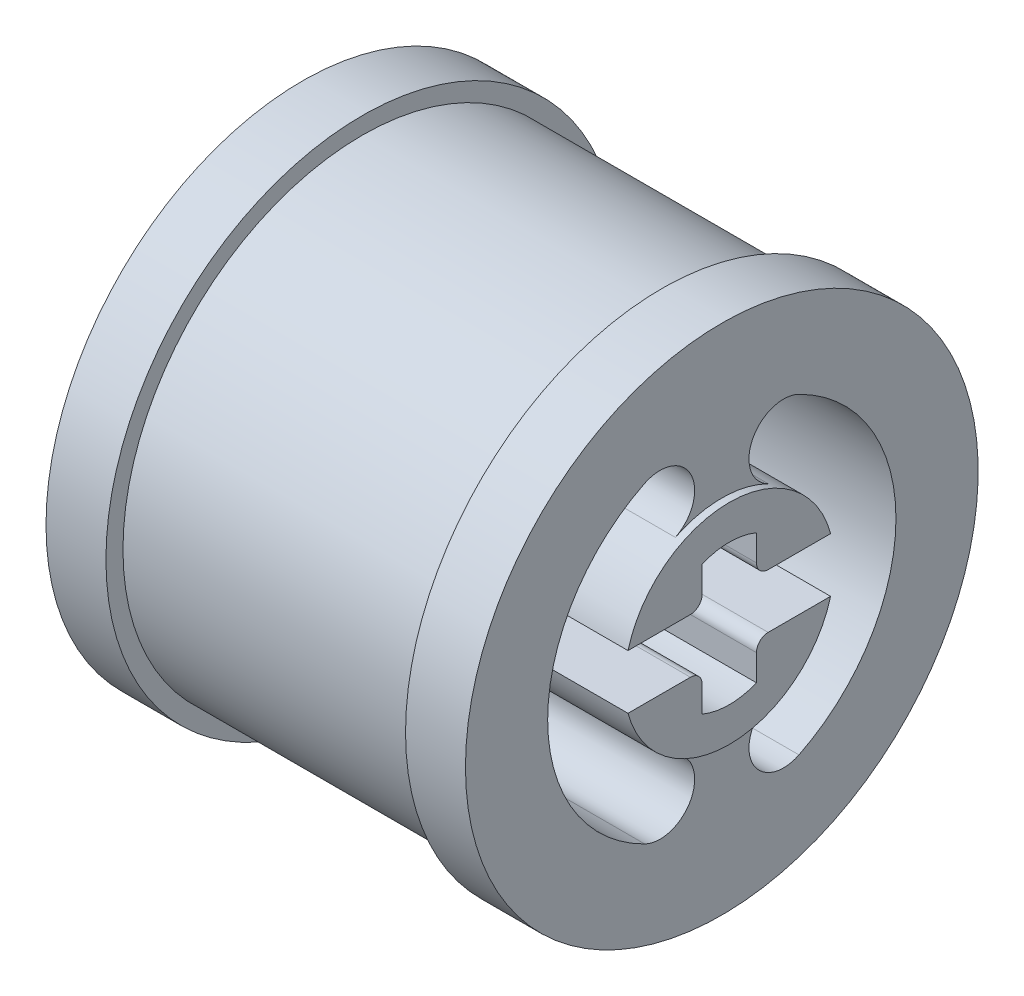
ISO-10303-21;
HEADER;
FILE_DESCRIPTION(('STEP AP214'),'2;1');
FILE_NAME('part.step','',(''),(''),'','','');
FILE_SCHEMA(('AUTOMOTIVE_DESIGN { 1 0 10303 214 1 1 1 1 }'));
ENDSEC;
DATA;
#1=APPLICATION_CONTEXT('core data for automotive mechanical design processes');
#2=APPLICATION_PROTOCOL_DEFINITION('international standard','automotive_design',2000,#1);
#3=PRODUCT_CONTEXT('',#1,'mechanical');
#4=PRODUCT('Part','Part','',(#3));
#5=PRODUCT_RELATED_PRODUCT_CATEGORY('part','',(#4));
#6=PRODUCT_DEFINITION_FORMATION('','',#4);
#7=PRODUCT_DEFINITION_CONTEXT('part definition',#1,'design');
#8=PRODUCT_DEFINITION('design','',#6,#7);
#9=PRODUCT_DEFINITION_SHAPE('','',#8);
#10=(LENGTH_UNIT() NAMED_UNIT(*) SI_UNIT(.MILLI.,.METRE.));
#11=(NAMED_UNIT(*) PLANE_ANGLE_UNIT() SI_UNIT($,.RADIAN.));
#12=(NAMED_UNIT(*) SI_UNIT($,.STERADIAN.) SOLID_ANGLE_UNIT());
#13=UNCERTAINTY_MEASURE_WITH_UNIT(LENGTH_MEASURE(1.E-05),#10,'distance_accuracy_value','');
#14=(GEOMETRIC_REPRESENTATION_CONTEXT(3) GLOBAL_UNCERTAINTY_ASSIGNED_CONTEXT((#13)) GLOBAL_UNIT_ASSIGNED_CONTEXT((#10,
#11,#12)) REPRESENTATION_CONTEXT('',''));
#15=CARTESIAN_POINT('',(0.,0.,0.));
#16=DIRECTION('',(0.,0.,1.));
#17=DIRECTION('',(1.,0.,0.));
#18=AXIS2_PLACEMENT_3D('',#15,#16,#17);
#19=CARTESIAN_POINT('',(7.366,0.,0.));
#20=DIRECTION('',(-1.,0.,0.));
#21=DIRECTION('',(0.,0.,1.));
#22=AXIS2_PLACEMENT_3D('',#19,#20,#21);
#23=CYLINDRICAL_SURFACE('',#22,3.556);
#24=CARTESIAN_POINT('',(-7.112,0.,0.));
#25=DIRECTION('',(-1.,0.,0.));
#26=DIRECTION('',(0.,0.,1.));
#27=AXIS2_PLACEMENT_3D('',#24,#25,#26);
#28=CIRCLE('',#27,3.556);
#29=CARTESIAN_POINT('',(-7.112,-3.18811339516092,1.57514093959732));
#30=VERTEX_POINT('',#29);
#31=CARTESIAN_POINT('',(-7.112,-3.18811339516092,-1.57514093959732));
#32=VERTEX_POINT('',#31);
#33=EDGE_CURVE('E283',#30,#32,#28,.F.);
#34=ORIENTED_EDGE('',*,*,#33,.F.);
#35=DIRECTION('',(1.,0.,0.));
#36=VECTOR('',#35,1.);
#37=CARTESIAN_POINT('',(0.,-3.18811339516092,1.57514093959732));
#38=LINE('',#37,#36);
#39=CARTESIAN_POINT('',(7.112,-3.18811339516092,1.57514093959732));
#40=VERTEX_POINT('',#39);
#41=EDGE_CURVE('E366',#30,#40,#38,.T.);
#42=ORIENTED_EDGE('',*,*,#41,.T.);
#43=CARTESIAN_POINT('',(7.112,0.,0.));
#44=DIRECTION('',(-1.,0.,0.));
#45=DIRECTION('',(0.,0.,1.));
#46=AXIS2_PLACEMENT_3D('',#43,#44,#45);
#47=CIRCLE('',#46,3.556);
#48=CARTESIAN_POINT('',(7.112,-3.18811339516092,-1.57514093959732));
#49=VERTEX_POINT('',#48);
#50=EDGE_CURVE('E383',#40,#49,#47,.F.);
#51=ORIENTED_EDGE('',*,*,#50,.T.);
#52=DIRECTION('',(1.,0.,0.));
#53=VECTOR('',#52,1.);
#54=CARTESIAN_POINT('',(0.,-3.18811339516092,-1.57514093959732));
#55=LINE('',#54,#53);
#56=EDGE_CURVE('E348',#32,#49,#55,.T.);
#57=ORIENTED_EDGE('',*,*,#56,.F.);
#58=EDGE_LOOP('',(#34,#42,#51,#57));
#59=FACE_BOUND('',#58,.T.);
#60=DIRECTION('',(1.,0.,0.));
#61=VECTOR('',#60,1.);
#62=CARTESIAN_POINT('',(0.,-0.92075,-3.43472785493989));
#63=LINE('',#62,#61);
#64=CARTESIAN_POINT('',(-7.366,-0.92075,-3.43472785493989));
#65=VERTEX_POINT('',#64);
#66=CARTESIAN_POINT('',(7.366,-0.92075,-3.43472785493989));
#67=VERTEX_POINT('',#66);
#68=EDGE_CURVE('E318',#65,#67,#63,.T.);
#69=ORIENTED_EDGE('',*,*,#68,.T.);
#70=CARTESIAN_POINT('',(7.366,0.,0.));
#71=DIRECTION('',(1.,0.,0.));
#72=DIRECTION('',(0.,0.,-1.));
#73=AXIS2_PLACEMENT_3D('',#70,#71,#72);
#74=CIRCLE('',#73,3.556);
#75=CARTESIAN_POINT('',(7.366,-0.920749999999999,3.43472785493989));
#76=VERTEX_POINT('',#75);
#77=EDGE_CURVE('E362',#76,#67,#74,.T.);
#78=ORIENTED_EDGE('',*,*,#77,.F.);
#79=DIRECTION('',(1.,0.,0.));
#80=VECTOR('',#79,1.);
#81=CARTESIAN_POINT('',(0.,-0.920749999999999,3.43472785493989));
#82=LINE('',#81,#80);
#83=CARTESIAN_POINT('',(-7.366,-0.920749999999999,3.43472785493989));
#84=VERTEX_POINT('',#83);
#85=EDGE_CURVE('E328',#84,#76,#82,.T.);
#86=ORIENTED_EDGE('',*,*,#85,.F.);
#87=CARTESIAN_POINT('',(-7.366,0.,0.));
#88=DIRECTION('',(1.,0.,0.));
#89=DIRECTION('',(0.,0.,-1.));
#90=AXIS2_PLACEMENT_3D('',#87,#88,#89);
#91=CIRCLE('',#90,3.556);
#92=EDGE_CURVE('E269',#84,#65,#91,.T.);
#93=ORIENTED_EDGE('',*,*,#92,.T.);
#94=EDGE_LOOP('',(#69,#78,#86,#93));
#95=FACE_BOUND('',#94,.T.);
#96=ADVANCED_FACE('F40',(#59,#95),#23,.T.);
#97=CARTESIAN_POINT('',(-7.366,0.92075,-3.43472785493989));
#98=VERTEX_POINT('',#97);
#99=CARTESIAN_POINT('',(-7.366,0.92075,3.43472785493989));
#100=VERTEX_POINT('',#99);
#101=EDGE_CURVE('E270',#98,#100,#91,.T.);
#102=ORIENTED_EDGE('',*,*,#101,.T.);
#103=DIRECTION('',(1.,0.,0.));
#104=VECTOR('',#103,1.);
#105=CARTESIAN_POINT('',(0.,0.92075,3.43472785493989));
#106=LINE('',#105,#104);
#107=CARTESIAN_POINT('',(7.366,0.92075,3.43472785493989));
#108=VERTEX_POINT('',#107);
#109=EDGE_CURVE('E330',#100,#108,#106,.T.);
#110=ORIENTED_EDGE('',*,*,#109,.T.);
#111=CARTESIAN_POINT('',(7.366,0.92075,-3.43472785493989));
#112=VERTEX_POINT('',#111);
#113=EDGE_CURVE('E370',#112,#108,#74,.T.);
#114=ORIENTED_EDGE('',*,*,#113,.F.);
#115=DIRECTION('',(1.,0.,0.));
#116=VECTOR('',#115,1.);
#117=CARTESIAN_POINT('',(0.,0.92075,-3.43472785493989));
#118=LINE('',#117,#116);
#119=EDGE_CURVE('E212',#98,#112,#118,.T.);
#120=ORIENTED_EDGE('',*,*,#119,.F.);
#121=EDGE_LOOP('',(#102,#110,#114,#120));
#122=FACE_BOUND('',#121,.T.);
#123=DIRECTION('',(1.,0.,0.));
#124=VECTOR('',#123,1.);
#125=CARTESIAN_POINT('',(0.,3.18811339516092,1.57514093959732));
#126=LINE('',#125,#124);
#127=CARTESIAN_POINT('',(-7.112,3.18811339516092,1.57514093959732));
#128=VERTEX_POINT('',#127);
#129=CARTESIAN_POINT('',(7.112,3.18811339516092,1.57514093959732));
#130=VERTEX_POINT('',#129);
#131=EDGE_CURVE('E363',#128,#130,#126,.T.);
#132=ORIENTED_EDGE('',*,*,#131,.F.);
#133=CARTESIAN_POINT('',(-7.112,3.18811339516092,-1.57514093959732));
#134=VERTEX_POINT('',#133);
#135=EDGE_CURVE('E282',#134,#128,#28,.F.);
#136=ORIENTED_EDGE('',*,*,#135,.F.);
#137=DIRECTION('',(1.,0.,0.));
#138=VECTOR('',#137,1.);
#139=CARTESIAN_POINT('',(0.,3.18811339516092,-1.57514093959732));
#140=LINE('',#139,#138);
#141=CARTESIAN_POINT('',(7.112,3.18811339516092,-1.57514093959732));
#142=VERTEX_POINT('',#141);
#143=EDGE_CURVE('E342',#134,#142,#140,.T.);
#144=ORIENTED_EDGE('',*,*,#143,.T.);
#145=EDGE_CURVE('E382',#142,#130,#47,.F.);
#146=ORIENTED_EDGE('',*,*,#145,.T.);
#147=EDGE_LOOP('',(#132,#136,#144,#146));
#148=FACE_BOUND('',#147,.T.);
#149=ADVANCED_FACE('F450',(#122,#148),#23,.T.);
#150=CARTESIAN_POINT('',(7.366,0.,0.));
#151=DIRECTION('',(1.,0.,0.));
#152=DIRECTION('',(0.,0.,-1.));
#153=AXIS2_PLACEMENT_3D('',#150,#151,#152);
#154=PLANE('',#153);
#155=DIRECTION('',(0.,-1.,0.));
#156=VECTOR('',#155,1.);
#157=CARTESIAN_POINT('',(7.366,-0.92075,0.92075));
#158=LINE('',#157,#156);
#159=CARTESIAN_POINT('',(7.366,-1.317625,0.92075));
#160=VERTEX_POINT('',#159);
#161=CARTESIAN_POINT('',(7.366,-2.20291924443453,0.92075));
#162=VERTEX_POINT('',#161);
#163=EDGE_CURVE('E309',#160,#162,#158,.T.);
#164=ORIENTED_EDGE('',*,*,#163,.F.);
#165=CARTESIAN_POINT('',(7.366,-1.317625,1.317625));
#166=DIRECTION('',(1.,0.,0.));
#167=DIRECTION('',(0.,0.,-1.));
#168=AXIS2_PLACEMENT_3D('',#165,#166,#167);
#169=CIRCLE('',#168,0.396875);
#170=CARTESIAN_POINT('',(7.366,-0.92075,1.317625));
#171=VERTEX_POINT('',#170);
#172=EDGE_CURVE('E55',#160,#171,#169,.T.);
#173=ORIENTED_EDGE('',*,*,#172,.T.);
#174=DIRECTION('',(0.,0.,-1.));
#175=VECTOR('',#174,1.);
#176=CARTESIAN_POINT('',(7.366,-0.92075,3.43472785493989));
#177=LINE('',#176,#175);
#178=EDGE_CURVE('E307',#76,#171,#177,.T.);
#179=ORIENTED_EDGE('',*,*,#178,.F.);
#180=ORIENTED_EDGE('',*,*,#77,.T.);
#181=DIRECTION('',(0.,0.,1.));
#182=VECTOR('',#181,1.);
#183=CARTESIAN_POINT('',(7.366,-0.92075,-3.43472785493989));
#184=LINE('',#183,#182);
#185=CARTESIAN_POINT('',(7.366,-0.92075,-1.317625));
#186=VERTEX_POINT('',#185);
#187=EDGE_CURVE('E316',#67,#186,#184,.T.);
#188=ORIENTED_EDGE('',*,*,#187,.T.);
#189=CARTESIAN_POINT('',(7.366,-1.317625,-1.317625));
#190=DIRECTION('',(1.,0.,0.));
#191=DIRECTION('',(0.,0.,-1.));
#192=AXIS2_PLACEMENT_3D('',#189,#190,#191);
#193=CIRCLE('',#192,0.396875);
#194=CARTESIAN_POINT('',(7.366,-1.317625,-0.92075));
#195=VERTEX_POINT('',#194);
#196=EDGE_CURVE('E62',#186,#195,#193,.T.);
#197=ORIENTED_EDGE('',*,*,#196,.T.);
#198=DIRECTION('',(0.,-1.,0.));
#199=VECTOR('',#198,1.);
#200=CARTESIAN_POINT('',(7.366,-0.92075,-0.92075));
#201=LINE('',#200,#199);
#202=CARTESIAN_POINT('',(7.366,-2.20291924443453,-0.92075));
#203=VERTEX_POINT('',#202);
#204=EDGE_CURVE('E314',#195,#203,#201,.T.);
#205=ORIENTED_EDGE('',*,*,#204,.T.);
#206=CARTESIAN_POINT('',(7.366,0.,0.));
#207=DIRECTION('',(-1.,0.,0.));
#208=DIRECTION('',(0.,0.,1.));
#209=AXIS2_PLACEMENT_3D('',#206,#207,#208);
#210=CIRCLE('',#209,2.3876);
#211=EDGE_CURVE('E311',#203,#162,#210,.T.);
#212=ORIENTED_EDGE('',*,*,#211,.T.);
#213=EDGE_LOOP('',(#164,#173,#179,#180,#188,#197,#205,#212));
#214=FACE_BOUND('',#213,.T.);
#215=ADVANCED_FACE('F412',(#214),#154,.T.);
#216=DIRECTION('',(0.,1.,0.));
#217=VECTOR('',#216,1.);
#218=CARTESIAN_POINT('',(7.366,0.92075,-0.92075));
#219=LINE('',#218,#217);
#220=CARTESIAN_POINT('',(7.366,1.317625,-0.92075));
#221=VERTEX_POINT('',#220);
#222=CARTESIAN_POINT('',(7.366,2.20291924443453,-0.92075));
#223=VERTEX_POINT('',#222);
#224=EDGE_CURVE('E207',#221,#223,#219,.T.);
#225=ORIENTED_EDGE('',*,*,#224,.F.);
#226=CARTESIAN_POINT('',(7.366,1.317625,-1.317625));
#227=DIRECTION('',(1.,0.,0.));
#228=DIRECTION('',(0.,0.,-1.));
#229=AXIS2_PLACEMENT_3D('',#226,#227,#228);
#230=CIRCLE('',#229,0.396875);
#231=CARTESIAN_POINT('',(7.366,0.92075,-1.317625));
#232=VERTEX_POINT('',#231);
#233=EDGE_CURVE('E390',#221,#232,#230,.T.);
#234=ORIENTED_EDGE('',*,*,#233,.T.);
#235=DIRECTION('',(0.,0.,1.));
#236=VECTOR('',#235,1.);
#237=CARTESIAN_POINT('',(7.366,0.92075,-3.43472785493989));
#238=LINE('',#237,#236);
#239=EDGE_CURVE('E296',#112,#232,#238,.T.);
#240=ORIENTED_EDGE('',*,*,#239,.F.);
#241=ORIENTED_EDGE('',*,*,#113,.T.);
#242=DIRECTION('',(0.,0.,-1.));
#243=VECTOR('',#242,1.);
#244=CARTESIAN_POINT('',(7.366,0.92075,3.43472785493989));
#245=LINE('',#244,#243);
#246=CARTESIAN_POINT('',(7.366,0.92075,1.317625));
#247=VERTEX_POINT('',#246);
#248=EDGE_CURVE('E304',#108,#247,#245,.T.);
#249=ORIENTED_EDGE('',*,*,#248,.T.);
#250=CARTESIAN_POINT('',(7.366,1.317625,1.317625));
#251=DIRECTION('',(1.,0.,0.));
#252=DIRECTION('',(0.,0.,-1.));
#253=AXIS2_PLACEMENT_3D('',#250,#251,#252);
#254=CIRCLE('',#253,0.396875);
#255=CARTESIAN_POINT('',(7.366,1.317625,0.92075));
#256=VERTEX_POINT('',#255);
#257=EDGE_CURVE('E388',#247,#256,#254,.T.);
#258=ORIENTED_EDGE('',*,*,#257,.T.);
#259=DIRECTION('',(0.,1.,0.));
#260=VECTOR('',#259,1.);
#261=CARTESIAN_POINT('',(7.366,0.92075,0.92075));
#262=LINE('',#261,#260);
#263=CARTESIAN_POINT('',(7.366,2.20291924443453,0.92075));
#264=VERTEX_POINT('',#263);
#265=EDGE_CURVE('E302',#256,#264,#262,.T.);
#266=ORIENTED_EDGE('',*,*,#265,.T.);
#267=CARTESIAN_POINT('',(7.366,0.,0.));
#268=DIRECTION('',(1.,0.,0.));
#269=DIRECTION('',(0.,0.,-1.));
#270=AXIS2_PLACEMENT_3D('',#267,#268,#269);
#271=CIRCLE('',#270,2.3876);
#272=EDGE_CURVE('E300',#223,#264,#271,.T.);
#273=ORIENTED_EDGE('',*,*,#272,.F.);
#274=EDGE_LOOP('',(#225,#234,#240,#241,#249,#258,#266,#273));
#275=FACE_BOUND('',#274,.T.);
#276=ADVANCED_FACE('F476',(#275),#154,.T.);
#277=CARTESIAN_POINT('',(7.112,0.,0.));
#278=DIRECTION('',(-1.,0.,0.));
#279=DIRECTION('',(0.,0.,1.));
#280=AXIS2_PLACEMENT_3D('',#277,#278,#279);
#281=PLANE('',#280);
#282=CARTESIAN_POINT('',(7.112,0.,0.));
#283=DIRECTION('',(-1.,0.,0.));
#284=DIRECTION('',(0.,0.,1.));
#285=AXIS2_PLACEMENT_3D('',#282,#283,#284);
#286=CIRCLE('',#285,8.69315);
#287=CARTESIAN_POINT('',(7.112,0.,8.69315));
#288=VERTEX_POINT('',#287);
#289=EDGE_CURVE('E379',#288,#288,#286,.T.);
#290=ORIENTED_EDGE('',*,*,#289,.F.);
#291=EDGE_LOOP('',(#290));
#292=FACE_BOUND('',#291,.T.);
#293=ORIENTED_EDGE('',*,*,#145,.F.);
#294=CARTESIAN_POINT('',(7.112,4.24132942749087,-2.0955));
#295=DIRECTION('',(1.,0.,0.));
#296=DIRECTION('',(0.,0.,-1.));
#297=AXIS2_PLACEMENT_3D('',#294,#295,#296);
#298=CIRCLE('',#297,1.17475);
#299=CARTESIAN_POINT('',(7.112,5.29454545982081,-2.61585906040269));
#300=VERTEX_POINT('',#299);
#301=EDGE_CURVE('E321',#300,#142,#298,.T.);
#302=ORIENTED_EDGE('',*,*,#301,.F.);
#303=CARTESIAN_POINT('',(7.112,0.,0.));
#304=DIRECTION('',(1.,0.,0.));
#305=DIRECTION('',(0.,0.,-1.));
#306=AXIS2_PLACEMENT_3D('',#303,#304,#305);
#307=CIRCLE('',#306,5.9055);
#308=CARTESIAN_POINT('',(7.112,-5.29454545982081,-2.61585906040268));
#309=VERTEX_POINT('',#308);
#310=EDGE_CURVE('E339',#309,#300,#307,.T.);
#311=ORIENTED_EDGE('',*,*,#310,.F.);
#312=CARTESIAN_POINT('',(7.112,-4.24132942749087,-2.0955));
#313=DIRECTION('',(-1.,0.,0.));
#314=DIRECTION('',(0.,0.,1.));
#315=AXIS2_PLACEMENT_3D('',#312,#313,#314);
#316=CIRCLE('',#315,1.17475);
#317=EDGE_CURVE('E336',#309,#49,#316,.T.);
#318=ORIENTED_EDGE('',*,*,#317,.T.);
#319=ORIENTED_EDGE('',*,*,#50,.F.);
#320=CARTESIAN_POINT('',(7.112,-4.24132942749087,2.0955));
#321=DIRECTION('',(1.,0.,0.));
#322=DIRECTION('',(0.,0.,-1.));
#323=AXIS2_PLACEMENT_3D('',#320,#321,#322);
#324=CIRCLE('',#323,1.17475);
#325=CARTESIAN_POINT('',(7.112,-5.29454545982081,2.61585906040269));
#326=VERTEX_POINT('',#325);
#327=EDGE_CURVE('E354',#326,#40,#324,.T.);
#328=ORIENTED_EDGE('',*,*,#327,.F.);
#329=CARTESIAN_POINT('',(7.112,0.,0.));
#330=DIRECTION('',(1.,0.,0.));
#331=DIRECTION('',(0.,0.,-1.));
#332=AXIS2_PLACEMENT_3D('',#329,#330,#331);
#333=CIRCLE('',#332,5.9055);
#334=CARTESIAN_POINT('',(7.112,5.29454545982081,2.61585906040269));
#335=VERTEX_POINT('',#334);
#336=EDGE_CURVE('E345',#335,#326,#333,.T.);
#337=ORIENTED_EDGE('',*,*,#336,.F.);
#338=CARTESIAN_POINT('',(7.112,4.24132942749087,2.0955));
#339=DIRECTION('',(-1.,0.,0.));
#340=DIRECTION('',(0.,0.,1.));
#341=AXIS2_PLACEMENT_3D('',#338,#339,#340);
#342=CIRCLE('',#341,1.17475);
#343=EDGE_CURVE('E356',#335,#130,#342,.T.);
#344=ORIENTED_EDGE('',*,*,#343,.T.);
#345=EDGE_LOOP('',(#293,#302,#311,#318,#319,#328,#337,#344));
#346=FACE_BOUND('',#345,.T.);
#347=ADVANCED_FACE('F473',(#292,#346),#281,.F.);
#348=CARTESIAN_POINT('',(0.,0.,0.));
#349=DIRECTION('',(-1.,0.,0.));
#350=DIRECTION('',(0.,0.,1.));
#351=AXIS2_PLACEMENT_3D('',#348,#349,#350);
#352=CYLINDRICAL_SURFACE('',#351,8.69315);
#353=ORIENTED_EDGE('',*,*,#289,.T.);
#354=EDGE_LOOP('',(#353));
#355=FACE_BOUND('',#354,.T.);
#356=CARTESIAN_POINT('',(5.08,0.,0.));
#357=DIRECTION('',(-1.,0.,0.));
#358=DIRECTION('',(0.,0.,1.));
#359=AXIS2_PLACEMENT_3D('',#356,#357,#358);
#360=CIRCLE('',#359,8.69315);
#361=CARTESIAN_POINT('',(5.08,0.,8.69315));
#362=VERTEX_POINT('',#361);
#363=EDGE_CURVE('E376',#362,#362,#360,.T.);
#364=ORIENTED_EDGE('',*,*,#363,.F.);
#365=EDGE_LOOP('',(#364));
#366=FACE_BOUND('',#365,.T.);
#367=ADVANCED_FACE('F469',(#355,#366),#352,.T.);
#368=CARTESIAN_POINT('',(5.08,8.1153,0.));
#369=DIRECTION('',(-1.,0.,0.));
#370=DIRECTION('',(0.,0.,1.));
#371=AXIS2_PLACEMENT_3D('',#368,#369,#370);
#372=PLANE('',#371);
#373=ORIENTED_EDGE('',*,*,#363,.T.);
#374=EDGE_LOOP('',(#373));
#375=FACE_BOUND('',#374,.T.);
#376=CARTESIAN_POINT('',(5.08,0.,0.));
#377=DIRECTION('',(-1.,0.,0.));
#378=DIRECTION('',(0.,0.,1.));
#379=AXIS2_PLACEMENT_3D('',#376,#377,#378);
#380=CIRCLE('',#379,8.1153);
#381=CARTESIAN_POINT('',(5.08,0.,8.1153));
#382=VERTEX_POINT('',#381);
#383=EDGE_CURVE('E373',#382,#382,#380,.T.);
#384=ORIENTED_EDGE('',*,*,#383,.F.);
#385=EDGE_LOOP('',(#384));
#386=FACE_BOUND('',#385,.T.);
#387=ADVANCED_FACE('F465',(#375,#386),#372,.T.);
#388=CARTESIAN_POINT('',(0.,0.,0.));
#389=DIRECTION('',(-1.,0.,0.));
#390=DIRECTION('',(0.,0.,1.));
#391=AXIS2_PLACEMENT_3D('',#388,#389,#390);
#392=CYLINDRICAL_SURFACE('',#391,8.1153);
#393=ORIENTED_EDGE('',*,*,#383,.T.);
#394=EDGE_LOOP('',(#393));
#395=FACE_BOUND('',#394,.T.);
#396=CARTESIAN_POINT('',(-5.08,0.,0.));
#397=DIRECTION('',(-1.,0.,0.));
#398=DIRECTION('',(0.,0.,1.));
#399=AXIS2_PLACEMENT_3D('',#396,#397,#398);
#400=CIRCLE('',#399,8.1153);
#401=CARTESIAN_POINT('',(-5.08,0.,8.1153));
#402=VERTEX_POINT('',#401);
#403=EDGE_CURVE('E273',#402,#402,#400,.T.);
#404=ORIENTED_EDGE('',*,*,#403,.F.);
#405=EDGE_LOOP('',(#404));
#406=FACE_BOUND('',#405,.T.);
#407=ADVANCED_FACE('F461',(#395,#406),#392,.T.);
#408=CARTESIAN_POINT('',(0.,0.,0.));
#409=DIRECTION('',(1.,0.,0.));
#410=DIRECTION('',(0.,0.,-1.));
#411=AXIS2_PLACEMENT_3D('',#408,#409,#410);
#412=CYLINDRICAL_SURFACE('',#411,5.9055);
#413=ORIENTED_EDGE('',*,*,#336,.T.);
#414=DIRECTION('',(1.,0.,0.));
#415=VECTOR('',#414,1.);
#416=CARTESIAN_POINT('',(0.,-5.29454545982081,2.61585906040269));
#417=LINE('',#416,#415);
#418=CARTESIAN_POINT('',(-7.112,-5.29454545982081,2.61585906040269));
#419=VERTEX_POINT('',#418);
#420=EDGE_CURVE('E359',#419,#326,#417,.T.);
#421=ORIENTED_EDGE('',*,*,#420,.F.);
#422=CARTESIAN_POINT('',(-7.112,0.,0.));
#423=DIRECTION('',(1.,0.,0.));
#424=DIRECTION('',(0.,0.,-1.));
#425=AXIS2_PLACEMENT_3D('',#422,#423,#424);
#426=CIRCLE('',#425,5.9055);
#427=CARTESIAN_POINT('',(-7.112,5.29454545982081,2.61585906040269));
#428=VERTEX_POINT('',#427);
#429=EDGE_CURVE('E260',#428,#419,#426,.T.);
#430=ORIENTED_EDGE('',*,*,#429,.F.);
#431=DIRECTION('',(1.,0.,0.));
#432=VECTOR('',#431,1.);
#433=CARTESIAN_POINT('',(0.,5.29454545982081,2.61585906040269));
#434=LINE('',#433,#432);
#435=EDGE_CURVE('E360',#428,#335,#434,.T.);
#436=ORIENTED_EDGE('',*,*,#435,.T.);
#437=EDGE_LOOP('',(#413,#421,#430,#436));
#438=FACE_BOUND('',#437,.T.);
#439=ADVANCED_FACE('F464',(#438),#412,.F.);
#440=CARTESIAN_POINT('',(0.,4.24132942749087,2.0955));
#441=DIRECTION('',(1.,0.,0.));
#442=DIRECTION('',(0.,0.,-1.));
#443=AXIS2_PLACEMENT_3D('',#440,#441,#442);
#444=CYLINDRICAL_SURFACE('',#443,1.17475);
#445=ORIENTED_EDGE('',*,*,#343,.F.);
#446=ORIENTED_EDGE('',*,*,#435,.F.);
#447=CARTESIAN_POINT('',(-7.112,4.24132942749087,2.0955));
#448=DIRECTION('',(-1.,0.,0.));
#449=DIRECTION('',(0.,0.,1.));
#450=AXIS2_PLACEMENT_3D('',#447,#448,#449);
#451=CIRCLE('',#450,1.17475);
#452=EDGE_CURVE('E266',#428,#128,#451,.T.);
#453=ORIENTED_EDGE('',*,*,#452,.T.);
#454=ORIENTED_EDGE('',*,*,#131,.T.);
#455=EDGE_LOOP('',(#445,#446,#453,#454));
#456=FACE_BOUND('',#455,.T.);
#457=ADVANCED_FACE('F717',(#456),#444,.F.);
#458=CARTESIAN_POINT('',(0.,-4.24132942749087,2.0955));
#459=DIRECTION('',(1.,0.,0.));
#460=DIRECTION('',(0.,0.,-1.));
#461=AXIS2_PLACEMENT_3D('',#458,#459,#460);
#462=CYLINDRICAL_SURFACE('',#461,1.17475);
#463=ORIENTED_EDGE('',*,*,#327,.T.);
#464=ORIENTED_EDGE('',*,*,#41,.F.);
#465=CARTESIAN_POINT('',(-7.112,-4.24132942749087,2.0955));
#466=DIRECTION('',(1.,0.,0.));
#467=DIRECTION('',(0.,0.,-1.));
#468=AXIS2_PLACEMENT_3D('',#465,#466,#467);
#469=CIRCLE('',#468,1.17475);
#470=EDGE_CURVE('E263',#419,#30,#469,.T.);
#471=ORIENTED_EDGE('',*,*,#470,.F.);
#472=ORIENTED_EDGE('',*,*,#420,.T.);
#473=EDGE_LOOP('',(#463,#464,#471,#472));
#474=FACE_BOUND('',#473,.T.);
#475=ADVANCED_FACE('F706',(#474),#462,.F.);
#476=CARTESIAN_POINT('',(0.,4.24132942749087,-2.0955));
#477=DIRECTION('',(1.,0.,0.));
#478=DIRECTION('',(0.,0.,-1.));
#479=AXIS2_PLACEMENT_3D('',#476,#477,#478);
#480=CYLINDRICAL_SURFACE('',#479,1.17475);
#481=ORIENTED_EDGE('',*,*,#301,.T.);
#482=ORIENTED_EDGE('',*,*,#143,.F.);
#483=CARTESIAN_POINT('',(-7.112,4.24132942749087,-2.0955));
#484=DIRECTION('',(1.,0.,0.));
#485=DIRECTION('',(0.,0.,-1.));
#486=AXIS2_PLACEMENT_3D('',#483,#484,#485);
#487=CIRCLE('',#486,1.17475);
#488=CARTESIAN_POINT('',(-7.112,5.29454545982081,-2.61585906040269));
#489=VERTEX_POINT('',#488);
#490=EDGE_CURVE('E251',#489,#134,#487,.T.);
#491=ORIENTED_EDGE('',*,*,#490,.F.);
#492=DIRECTION('',(1.,0.,0.));
#493=VECTOR('',#492,1.);
#494=CARTESIAN_POINT('',(0.,5.29454545982081,-2.61585906040269));
#495=LINE('',#494,#493);
#496=EDGE_CURVE('E343',#489,#300,#495,.T.);
#497=ORIENTED_EDGE('',*,*,#496,.T.);
#498=EDGE_LOOP('',(#481,#482,#491,#497));
#499=FACE_BOUND('',#498,.T.);
#500=ADVANCED_FACE('F695',(#499),#480,.F.);
#501=CARTESIAN_POINT('',(0.,0.,0.));
#502=DIRECTION('',(1.,0.,0.));
#503=DIRECTION('',(0.,0.,-1.));
#504=AXIS2_PLACEMENT_3D('',#501,#502,#503);
#505=CYLINDRICAL_SURFACE('',#504,5.9055);
#506=ORIENTED_EDGE('',*,*,#310,.T.);
#507=ORIENTED_EDGE('',*,*,#496,.F.);
#508=CARTESIAN_POINT('',(-7.112,0.,0.));
#509=DIRECTION('',(1.,0.,0.));
#510=DIRECTION('',(0.,0.,-1.));
#511=AXIS2_PLACEMENT_3D('',#508,#509,#510);
#512=CIRCLE('',#511,5.9055);
#513=CARTESIAN_POINT('',(-7.112,-5.29454545982081,-2.61585906040268));
#514=VERTEX_POINT('',#513);
#515=EDGE_CURVE('E257',#514,#489,#512,.T.);
#516=ORIENTED_EDGE('',*,*,#515,.F.);
#517=DIRECTION('',(1.,0.,0.));
#518=VECTOR('',#517,1.);
#519=CARTESIAN_POINT('',(0.,-5.29454545982081,-2.61585906040268));
#520=LINE('',#519,#518);
#521=EDGE_CURVE('E346',#514,#309,#520,.T.);
#522=ORIENTED_EDGE('',*,*,#521,.T.);
#523=EDGE_LOOP('',(#506,#507,#516,#522));
#524=FACE_BOUND('',#523,.T.);
#525=ADVANCED_FACE('F683',(#524),#505,.F.);
#526=CARTESIAN_POINT('',(0.,-4.24132942749087,-2.0955));
#527=DIRECTION('',(1.,0.,0.));
#528=DIRECTION('',(0.,0.,-1.));
#529=AXIS2_PLACEMENT_3D('',#526,#527,#528);
#530=CYLINDRICAL_SURFACE('',#529,1.17475);
#531=ORIENTED_EDGE('',*,*,#317,.F.);
#532=ORIENTED_EDGE('',*,*,#521,.F.);
#533=CARTESIAN_POINT('',(-7.112,-4.24132942749087,-2.0955));
#534=DIRECTION('',(-1.,0.,0.));
#535=DIRECTION('',(0.,0.,1.));
#536=AXIS2_PLACEMENT_3D('',#533,#534,#535);
#537=CIRCLE('',#536,1.17475);
#538=EDGE_CURVE('E254',#514,#32,#537,.T.);
#539=ORIENTED_EDGE('',*,*,#538,.T.);
#540=ORIENTED_EDGE('',*,*,#56,.T.);
#541=EDGE_LOOP('',(#531,#532,#539,#540));
#542=FACE_BOUND('',#541,.T.);
#543=ADVANCED_FACE('F678',(#542),#530,.F.);
#544=CARTESIAN_POINT('',(0.,0.92075,-3.43472785493989));
#545=DIRECTION('',(0.,1.,0.));
#546=DIRECTION('',(0.,0.,1.));
#547=AXIS2_PLACEMENT_3D('',#544,#545,#546);
#548=PLANE('',#547);
#549=ORIENTED_EDGE('',*,*,#239,.T.);
#550=DIRECTION('',(1.,0.,0.));
#551=VECTOR('',#550,1.);
#552=CARTESIAN_POINT('',(0.,0.92075,-1.317625));
#553=LINE('',#552,#551);
#554=CARTESIAN_POINT('',(-7.366,0.92075,-1.317625));
#555=VERTEX_POINT('',#554);
#556=EDGE_CURVE('E392',#232,#555,#553,.F.);
#557=ORIENTED_EDGE('',*,*,#556,.T.);
#558=DIRECTION('',(0.,0.,1.));
#559=VECTOR('',#558,1.);
#560=CARTESIAN_POINT('',(-7.366,0.92075,-3.43472785493989));
#561=LINE('',#560,#559);
#562=EDGE_CURVE('E228',#98,#555,#561,.T.);
#563=ORIENTED_EDGE('',*,*,#562,.F.);
#564=ORIENTED_EDGE('',*,*,#119,.T.);
#565=EDGE_LOOP('',(#549,#557,#563,#564));
#566=FACE_BOUND('',#565,.T.);
#567=ADVANCED_FACE('F611',(#566),#548,.F.);
#568=CARTESIAN_POINT('',(0.,0.92075,-0.92075));
#569=DIRECTION('',(0.,0.,-1.));
#570=DIRECTION('',(-1.,0.,0.));
#571=AXIS2_PLACEMENT_3D('',#568,#569,#570);
#572=PLANE('',#571);
#573=DIRECTION('',(1.,0.,0.));
#574=VECTOR('',#573,1.);
#575=CARTESIAN_POINT('',(0.,2.20291924443453,-0.92075));
#576=LINE('',#575,#574);
#577=CARTESIAN_POINT('',(-7.366,2.20291924443453,-0.92075));
#578=VERTEX_POINT('',#577);
#579=EDGE_CURVE('E200',#578,#223,#576,.T.);
#580=ORIENTED_EDGE('',*,*,#579,.F.);
#581=DIRECTION('',(0.,1.,0.));
#582=VECTOR('',#581,1.);
#583=CARTESIAN_POINT('',(-7.366,0.92075,-0.92075));
#584=LINE('',#583,#582);
#585=CARTESIAN_POINT('',(-7.366,1.317625,-0.92075));
#586=VERTEX_POINT('',#585);
#587=EDGE_CURVE('E205',#586,#578,#584,.T.);
#588=ORIENTED_EDGE('',*,*,#587,.F.);
#589=DIRECTION('',(1.,0.,0.));
#590=VECTOR('',#589,1.);
#591=CARTESIAN_POINT('',(0.,1.317625,-0.92075));
#592=LINE('',#591,#590);
#593=EDGE_CURVE('E386',#586,#221,#592,.T.);
#594=ORIENTED_EDGE('',*,*,#593,.T.);
#595=ORIENTED_EDGE('',*,*,#224,.T.);
#596=EDGE_LOOP('',(#580,#588,#594,#595));
#597=FACE_BOUND('',#596,.T.);
#598=ADVANCED_FACE('F202',(#597),#572,.F.);
#599=CARTESIAN_POINT('',(0.,0.,0.));
#600=DIRECTION('',(1.,0.,0.));
#601=DIRECTION('',(0.,0.,-1.));
#602=AXIS2_PLACEMENT_3D('',#599,#600,#601);
#603=CYLINDRICAL_SURFACE('',#602,2.3876);
#604=ORIENTED_EDGE('',*,*,#272,.T.);
#605=DIRECTION('',(1.,0.,0.));
#606=VECTOR('',#605,1.);
#607=CARTESIAN_POINT('',(0.,2.20291924443453,0.92075));
#608=LINE('',#607,#606);
#609=CARTESIAN_POINT('',(-7.366,2.20291924443453,0.92075));
#610=VERTEX_POINT('',#609);
#611=EDGE_CURVE('E211',#610,#264,#608,.T.);
#612=ORIENTED_EDGE('',*,*,#611,.F.);
#613=CARTESIAN_POINT('',(-7.366,0.,0.));
#614=DIRECTION('',(1.,0.,0.));
#615=DIRECTION('',(0.,0.,-1.));
#616=AXIS2_PLACEMENT_3D('',#613,#614,#615);
#617=CIRCLE('',#616,2.3876);
#618=EDGE_CURVE('E215',#578,#610,#617,.T.);
#619=ORIENTED_EDGE('',*,*,#618,.F.);
#620=ORIENTED_EDGE('',*,*,#579,.T.);
#621=EDGE_LOOP('',(#604,#612,#619,#620));
#622=FACE_BOUND('',#621,.T.);
#623=ADVANCED_FACE('F216',(#622),#603,.F.);
#624=CARTESIAN_POINT('',(0.,0.92075,0.92075));
#625=DIRECTION('',(0.,0.,-1.));
#626=DIRECTION('',(-1.,0.,0.));
#627=AXIS2_PLACEMENT_3D('',#624,#625,#626);
#628=PLANE('',#627);
#629=ORIENTED_EDGE('',*,*,#265,.F.);
#630=DIRECTION('',(1.,0.,0.));
#631=VECTOR('',#630,1.);
#632=CARTESIAN_POINT('',(0.,1.317625,0.92075));
#633=LINE('',#632,#631);
#634=CARTESIAN_POINT('',(-7.366,1.317625,0.92075));
#635=VERTEX_POINT('',#634);
#636=EDGE_CURVE('E397',#256,#635,#633,.F.);
#637=ORIENTED_EDGE('',*,*,#636,.T.);
#638=DIRECTION('',(0.,1.,0.));
#639=VECTOR('',#638,1.);
#640=CARTESIAN_POINT('',(-7.366,0.92075,0.92075));
#641=LINE('',#640,#639);
#642=EDGE_CURVE('E221',#635,#610,#641,.T.);
#643=ORIENTED_EDGE('',*,*,#642,.T.);
#644=ORIENTED_EDGE('',*,*,#611,.T.);
#645=EDGE_LOOP('',(#629,#637,#643,#644));
#646=FACE_BOUND('',#645,.T.);
#647=ADVANCED_FACE('F624',(#646),#628,.T.);
#648=CARTESIAN_POINT('',(0.,0.92075,3.43472785493989));
#649=DIRECTION('',(0.,-1.,0.));
#650=DIRECTION('',(0.,0.,-1.));
#651=AXIS2_PLACEMENT_3D('',#648,#649,#650);
#652=PLANE('',#651);
#653=ORIENTED_EDGE('',*,*,#109,.F.);
#654=DIRECTION('',(0.,0.,-1.));
#655=VECTOR('',#654,1.);
#656=CARTESIAN_POINT('',(-7.366,0.92075,3.43472785493989));
#657=LINE('',#656,#655);
#658=CARTESIAN_POINT('',(-7.366,0.92075,1.317625));
#659=VERTEX_POINT('',#658);
#660=EDGE_CURVE('E233',#100,#659,#657,.T.);
#661=ORIENTED_EDGE('',*,*,#660,.T.);
#662=DIRECTION('',(1.,0.,0.));
#663=VECTOR('',#662,1.);
#664=CARTESIAN_POINT('',(0.,0.92075,1.317625));
#665=LINE('',#664,#663);
#666=EDGE_CURVE('E394',#659,#247,#665,.T.);
#667=ORIENTED_EDGE('',*,*,#666,.T.);
#668=ORIENTED_EDGE('',*,*,#248,.F.);
#669=EDGE_LOOP('',(#653,#661,#667,#668));
#670=FACE_BOUND('',#669,.T.);
#671=ADVANCED_FACE('F507',(#670),#652,.T.);
#672=CARTESIAN_POINT('',(0.,-0.92075,-3.43472785493989));
#673=DIRECTION('',(0.,1.,0.));
#674=DIRECTION('',(0.,0.,1.));
#675=AXIS2_PLACEMENT_3D('',#672,#673,#674);
#676=PLANE('',#675);
#677=ORIENTED_EDGE('',*,*,#68,.F.);
#678=DIRECTION('',(0.,0.,1.));
#679=VECTOR('',#678,1.);
#680=CARTESIAN_POINT('',(-7.366,-0.92075,-3.43472785493989));
#681=LINE('',#680,#679);
#682=CARTESIAN_POINT('',(-7.366,-0.92075,-1.317625));
#683=VERTEX_POINT('',#682);
#684=EDGE_CURVE('E248',#65,#683,#681,.T.);
#685=ORIENTED_EDGE('',*,*,#684,.T.);
#686=DIRECTION('',(1.,0.,0.));
#687=VECTOR('',#686,1.);
#688=CARTESIAN_POINT('',(0.,-0.92075,-1.317625));
#689=LINE('',#688,#687);
#690=EDGE_CURVE('E48',#683,#186,#689,.T.);
#691=ORIENTED_EDGE('',*,*,#690,.T.);
#692=ORIENTED_EDGE('',*,*,#187,.F.);
#693=EDGE_LOOP('',(#677,#685,#691,#692));
#694=FACE_BOUND('',#693,.T.);
#695=ADVANCED_FACE('F407',(#694),#676,.T.);
#696=CARTESIAN_POINT('',(0.,-0.92075,-0.92075));
#697=DIRECTION('',(0.,0.,1.));
#698=DIRECTION('',(1.,0.,0.));
#699=AXIS2_PLACEMENT_3D('',#696,#697,#698);
#700=PLANE('',#699);
#701=ORIENTED_EDGE('',*,*,#204,.F.);
#702=DIRECTION('',(1.,0.,0.));
#703=VECTOR('',#702,1.);
#704=CARTESIAN_POINT('',(0.,-1.317625,-0.92075));
#705=LINE('',#704,#703);
#706=CARTESIAN_POINT('',(-7.366,-1.317625,-0.92075));
#707=VERTEX_POINT('',#706);
#708=EDGE_CURVE('E11',#195,#707,#705,.F.);
#709=ORIENTED_EDGE('',*,*,#708,.T.);
#710=DIRECTION('',(0.,-1.,0.));
#711=VECTOR('',#710,1.);
#712=CARTESIAN_POINT('',(-7.366,-0.92075,-0.92075));
#713=LINE('',#712,#711);
#714=CARTESIAN_POINT('',(-7.366,-2.20291924443453,-0.92075));
#715=VERTEX_POINT('',#714);
#716=EDGE_CURVE('E245',#707,#715,#713,.T.);
#717=ORIENTED_EDGE('',*,*,#716,.T.);
#718=DIRECTION('',(1.,0.,0.));
#719=VECTOR('',#718,1.);
#720=CARTESIAN_POINT('',(0.,-2.20291924443453,-0.92075));
#721=LINE('',#720,#719);
#722=EDGE_CURVE('E322',#715,#203,#721,.T.);
#723=ORIENTED_EDGE('',*,*,#722,.T.);
#724=EDGE_LOOP('',(#701,#709,#717,#723));
#725=FACE_BOUND('',#724,.T.);
#726=ADVANCED_FACE('F424',(#725),#700,.T.);
#727=CARTESIAN_POINT('',(0.,0.,0.));
#728=DIRECTION('',(1.,0.,0.));
#729=DIRECTION('',(0.,0.,-1.));
#730=AXIS2_PLACEMENT_3D('',#727,#728,#729);
#731=CYLINDRICAL_SURFACE('',#730,2.3876);
#732=ORIENTED_EDGE('',*,*,#211,.F.);
#733=ORIENTED_EDGE('',*,*,#722,.F.);
#734=CARTESIAN_POINT('',(-7.366,0.,0.));
#735=DIRECTION('',(-1.,0.,0.));
#736=DIRECTION('',(0.,0.,1.));
#737=AXIS2_PLACEMENT_3D('',#734,#735,#736);
#738=CIRCLE('',#737,2.3876);
#739=CARTESIAN_POINT('',(-7.366,-2.20291924443453,0.92075));
#740=VERTEX_POINT('',#739);
#741=EDGE_CURVE('E242',#715,#740,#738,.T.);
#742=ORIENTED_EDGE('',*,*,#741,.T.);
#743=DIRECTION('',(1.,0.,0.));
#744=VECTOR('',#743,1.);
#745=CARTESIAN_POINT('',(0.,-2.20291924443453,0.92075));
#746=LINE('',#745,#744);
#747=EDGE_CURVE('E325',#740,#162,#746,.T.);
#748=ORIENTED_EDGE('',*,*,#747,.T.);
#749=EDGE_LOOP('',(#732,#733,#742,#748));
#750=FACE_BOUND('',#749,.T.);
#751=ADVANCED_FACE('F427',(#750),#731,.F.);
#752=CARTESIAN_POINT('',(0.,-0.92075,0.92075));
#753=DIRECTION('',(0.,0.,1.));
#754=DIRECTION('',(1.,0.,0.));
#755=AXIS2_PLACEMENT_3D('',#752,#753,#754);
#756=PLANE('',#755);
#757=ORIENTED_EDGE('',*,*,#747,.F.);
#758=DIRECTION('',(0.,-1.,0.));
#759=VECTOR('',#758,1.);
#760=CARTESIAN_POINT('',(-7.366,-0.92075,0.92075));
#761=LINE('',#760,#759);
#762=CARTESIAN_POINT('',(-7.366,-1.317625,0.92075));
#763=VERTEX_POINT('',#762);
#764=EDGE_CURVE('E239',#763,#740,#761,.T.);
#765=ORIENTED_EDGE('',*,*,#764,.F.);
#766=DIRECTION('',(1.,0.,0.));
#767=VECTOR('',#766,1.);
#768=CARTESIAN_POINT('',(0.,-1.317625,0.92075));
#769=LINE('',#768,#767);
#770=EDGE_CURVE('E399',#763,#160,#769,.T.);
#771=ORIENTED_EDGE('',*,*,#770,.T.);
#772=ORIENTED_EDGE('',*,*,#163,.T.);
#773=EDGE_LOOP('',(#757,#765,#771,#772));
#774=FACE_BOUND('',#773,.T.);
#775=ADVANCED_FACE('F430',(#774),#756,.F.);
#776=CARTESIAN_POINT('',(0.,-0.92075,3.43472785493989));
#777=DIRECTION('',(0.,-1.,0.));
#778=DIRECTION('',(0.,0.,-1.));
#779=AXIS2_PLACEMENT_3D('',#776,#777,#778);
#780=PLANE('',#779);
#781=ORIENTED_EDGE('',*,*,#178,.T.);
#782=DIRECTION('',(1.,0.,0.));
#783=VECTOR('',#782,1.);
#784=CARTESIAN_POINT('',(0.,-0.92075,1.317625));
#785=LINE('',#784,#783);
#786=CARTESIAN_POINT('',(-7.366,-0.92075,1.317625));
#787=VERTEX_POINT('',#786);
#788=EDGE_CURVE('E404',#171,#787,#785,.F.);
#789=ORIENTED_EDGE('',*,*,#788,.T.);
#790=DIRECTION('',(0.,0.,-1.));
#791=VECTOR('',#790,1.);
#792=CARTESIAN_POINT('',(-7.366,-0.92075,3.43472785493989));
#793=LINE('',#792,#791);
#794=EDGE_CURVE('E236',#84,#787,#793,.T.);
#795=ORIENTED_EDGE('',*,*,#794,.F.);
#796=ORIENTED_EDGE('',*,*,#85,.T.);
#797=EDGE_LOOP('',(#781,#789,#795,#796));
#798=FACE_BOUND('',#797,.T.);
#799=ADVANCED_FACE('F436',(#798),#780,.F.);
#800=CARTESIAN_POINT('',(0.,1.317625,-1.317625));
#801=DIRECTION('',(1.,0.,0.));
#802=DIRECTION('',(0.,0.,-1.));
#803=AXIS2_PLACEMENT_3D('',#800,#801,#802);
#804=CYLINDRICAL_SURFACE('',#803,0.396875);
#805=ORIENTED_EDGE('',*,*,#593,.F.);
#806=CARTESIAN_POINT('',(-7.366,1.317625,-1.317625));
#807=DIRECTION('',(1.,0.,0.));
#808=DIRECTION('',(0.,0.,-1.));
#809=AXIS2_PLACEMENT_3D('',#806,#807,#808);
#810=CIRCLE('',#809,0.396875);
#811=EDGE_CURVE('E227',#586,#555,#810,.T.);
#812=ORIENTED_EDGE('',*,*,#811,.T.);
#813=ORIENTED_EDGE('',*,*,#556,.F.);
#814=ORIENTED_EDGE('',*,*,#233,.F.);
#815=EDGE_LOOP('',(#805,#812,#813,#814));
#816=FACE_BOUND('',#815,.T.);
#817=ADVANCED_FACE('F438',(#816),#804,.T.);
#818=CARTESIAN_POINT('',(0.,1.317625,1.317625));
#819=DIRECTION('',(1.,0.,0.));
#820=DIRECTION('',(0.,0.,-1.));
#821=AXIS2_PLACEMENT_3D('',#818,#819,#820);
#822=CYLINDRICAL_SURFACE('',#821,0.396875);
#823=ORIENTED_EDGE('',*,*,#666,.F.);
#824=CARTESIAN_POINT('',(-7.366,1.317625,1.317625));
#825=DIRECTION('',(1.,0.,0.));
#826=DIRECTION('',(0.,0.,-1.));
#827=AXIS2_PLACEMENT_3D('',#824,#825,#826);
#828=CIRCLE('',#827,0.396875);
#829=EDGE_CURVE('E286',#659,#635,#828,.T.);
#830=ORIENTED_EDGE('',*,*,#829,.T.);
#831=ORIENTED_EDGE('',*,*,#636,.F.);
#832=ORIENTED_EDGE('',*,*,#257,.F.);
#833=EDGE_LOOP('',(#823,#830,#831,#832));
#834=FACE_BOUND('',#833,.T.);
#835=ADVANCED_FACE('F444',(#834),#822,.T.);
#836=CARTESIAN_POINT('',(0.,-1.317625,1.317625));
#837=DIRECTION('',(1.,0.,0.));
#838=DIRECTION('',(0.,0.,-1.));
#839=AXIS2_PLACEMENT_3D('',#836,#837,#838);
#840=CYLINDRICAL_SURFACE('',#839,0.396875);
#841=ORIENTED_EDGE('',*,*,#770,.F.);
#842=CARTESIAN_POINT('',(-7.366,-1.317625,1.317625));
#843=DIRECTION('',(1.,0.,0.));
#844=DIRECTION('',(0.,0.,-1.));
#845=AXIS2_PLACEMENT_3D('',#842,#843,#844);
#846=CIRCLE('',#845,0.396875);
#847=EDGE_CURVE('E293',#763,#787,#846,.T.);
#848=ORIENTED_EDGE('',*,*,#847,.T.);
#849=ORIENTED_EDGE('',*,*,#788,.F.);
#850=ORIENTED_EDGE('',*,*,#172,.F.);
#851=EDGE_LOOP('',(#841,#848,#849,#850));
#852=FACE_BOUND('',#851,.T.);
#853=ADVANCED_FACE('F433',(#852),#840,.T.);
#854=CARTESIAN_POINT('',(0.,-1.317625,-1.317625));
#855=DIRECTION('',(1.,0.,0.));
#856=DIRECTION('',(0.,0.,-1.));
#857=AXIS2_PLACEMENT_3D('',#854,#855,#856);
#858=CYLINDRICAL_SURFACE('',#857,0.396875);
#859=ORIENTED_EDGE('',*,*,#690,.F.);
#860=CARTESIAN_POINT('',(-7.366,-1.317625,-1.317625));
#861=DIRECTION('',(1.,0.,0.));
#862=DIRECTION('',(0.,0.,-1.));
#863=AXIS2_PLACEMENT_3D('',#860,#861,#862);
#864=CIRCLE('',#863,0.396875);
#865=EDGE_CURVE('E290',#683,#707,#864,.T.);
#866=ORIENTED_EDGE('',*,*,#865,.T.);
#867=ORIENTED_EDGE('',*,*,#708,.F.);
#868=ORIENTED_EDGE('',*,*,#196,.F.);
#869=EDGE_LOOP('',(#859,#866,#867,#868));
#870=FACE_BOUND('',#869,.T.);
#871=ADVANCED_FACE('F42',(#870),#858,.T.);
#872=CARTESIAN_POINT('',(-7.366,0.,0.));
#873=DIRECTION('',(-1.,0.,0.));
#874=DIRECTION('',(0.,0.,-1.));
#875=AXIS2_PLACEMENT_3D('',#872,#873,#874);
#876=PLANE('',#875);
#877=ORIENTED_EDGE('',*,*,#764,.T.);
#878=ORIENTED_EDGE('',*,*,#741,.F.);
#879=ORIENTED_EDGE('',*,*,#716,.F.);
#880=ORIENTED_EDGE('',*,*,#865,.F.);
#881=ORIENTED_EDGE('',*,*,#684,.F.);
#882=ORIENTED_EDGE('',*,*,#92,.F.);
#883=ORIENTED_EDGE('',*,*,#794,.T.);
#884=ORIENTED_EDGE('',*,*,#847,.F.);
#885=EDGE_LOOP('',(#877,#878,#879,#880,#881,#882,#883,#884));
#886=FACE_BOUND('',#885,.T.);
#887=ADVANCED_FACE('F419',(#886),#876,.T.);
#888=ORIENTED_EDGE('',*,*,#587,.T.);
#889=ORIENTED_EDGE('',*,*,#618,.T.);
#890=ORIENTED_EDGE('',*,*,#642,.F.);
#891=ORIENTED_EDGE('',*,*,#829,.F.);
#892=ORIENTED_EDGE('',*,*,#660,.F.);
#893=ORIENTED_EDGE('',*,*,#101,.F.);
#894=ORIENTED_EDGE('',*,*,#562,.T.);
#895=ORIENTED_EDGE('',*,*,#811,.F.);
#896=EDGE_LOOP('',(#888,#889,#890,#891,#892,#893,#894,#895));
#897=FACE_BOUND('',#896,.T.);
#898=ADVANCED_FACE('F224',(#897),#876,.T.);
#899=CARTESIAN_POINT('',(-7.112,0.,0.));
#900=DIRECTION('',(1.,0.,0.));
#901=DIRECTION('',(0.,0.,1.));
#902=AXIS2_PLACEMENT_3D('',#899,#900,#901);
#903=PLANE('',#902);
#904=CARTESIAN_POINT('',(-7.112,0.,0.));
#905=DIRECTION('',(-1.,0.,0.));
#906=DIRECTION('',(0.,0.,1.));
#907=AXIS2_PLACEMENT_3D('',#904,#905,#906);
#908=CIRCLE('',#907,8.69315);
#909=CARTESIAN_POINT('',(-7.112,0.,8.69315));
#910=VERTEX_POINT('',#909);
#911=EDGE_CURVE('E279',#910,#910,#908,.T.);
#912=ORIENTED_EDGE('',*,*,#911,.T.);
#913=EDGE_LOOP('',(#912));
#914=FACE_BOUND('',#913,.T.);
#915=ORIENTED_EDGE('',*,*,#135,.T.);
#916=ORIENTED_EDGE('',*,*,#452,.F.);
#917=ORIENTED_EDGE('',*,*,#429,.T.);
#918=ORIENTED_EDGE('',*,*,#470,.T.);
#919=ORIENTED_EDGE('',*,*,#33,.T.);
#920=ORIENTED_EDGE('',*,*,#538,.F.);
#921=ORIENTED_EDGE('',*,*,#515,.T.);
#922=ORIENTED_EDGE('',*,*,#490,.T.);
#923=EDGE_LOOP('',(#915,#916,#917,#918,#919,#920,#921,#922));
#924=FACE_BOUND('',#923,.T.);
#925=ADVANCED_FACE('F492',(#914,#924),#903,.F.);
#926=CARTESIAN_POINT('',(0.,0.,0.));
#927=DIRECTION('',(1.,0.,0.));
#928=DIRECTION('',(0.,0.,1.));
#929=AXIS2_PLACEMENT_3D('',#926,#927,#928);
#930=CYLINDRICAL_SURFACE('',#929,8.69315);
#931=ORIENTED_EDGE('',*,*,#911,.F.);
#932=EDGE_LOOP('',(#931));
#933=FACE_BOUND('',#932,.T.);
#934=CARTESIAN_POINT('',(-5.08,0.,0.));
#935=DIRECTION('',(-1.,0.,0.));
#936=DIRECTION('',(0.,0.,1.));
#937=AXIS2_PLACEMENT_3D('',#934,#935,#936);
#938=CIRCLE('',#937,8.69315);
#939=CARTESIAN_POINT('',(-5.08,0.,8.69315));
#940=VERTEX_POINT('',#939);
#941=EDGE_CURVE('E276',#940,#940,#938,.T.);
#942=ORIENTED_EDGE('',*,*,#941,.T.);
#943=EDGE_LOOP('',(#942));
#944=FACE_BOUND('',#943,.T.);
#945=ADVANCED_FACE('F497',(#933,#944),#930,.T.);
#946=CARTESIAN_POINT('',(-5.08,8.1153,0.));
#947=DIRECTION('',(1.,0.,0.));
#948=DIRECTION('',(0.,0.,1.));
#949=AXIS2_PLACEMENT_3D('',#946,#947,#948);
#950=PLANE('',#949);
#951=ORIENTED_EDGE('',*,*,#941,.F.);
#952=EDGE_LOOP('',(#951));
#953=FACE_BOUND('',#952,.T.);
#954=ORIENTED_EDGE('',*,*,#403,.T.);
#955=EDGE_LOOP('',(#954));
#956=FACE_BOUND('',#955,.T.);
#957=ADVANCED_FACE('F494',(#953,#956),#950,.T.);
#958=CLOSED_SHELL('',(#96,#149,#215,#276,#347,#367,#387,#407,#439,#457,#475,#500,#525,#543,#567,
#598,#623,#647,#671,#695,#726,#751,#775,#799,#817,#835,#853,#871,#887,#898,#925,#945,#957));
#959=MANIFOLD_SOLID_BREP('B2',#958);
#960=ADVANCED_BREP_SHAPE_REPRESENTATION('',(#18,#959),#14);
#961=SHAPE_DEFINITION_REPRESENTATION(#9,#960);
ENDSEC;
END-ISO-10303-21;
